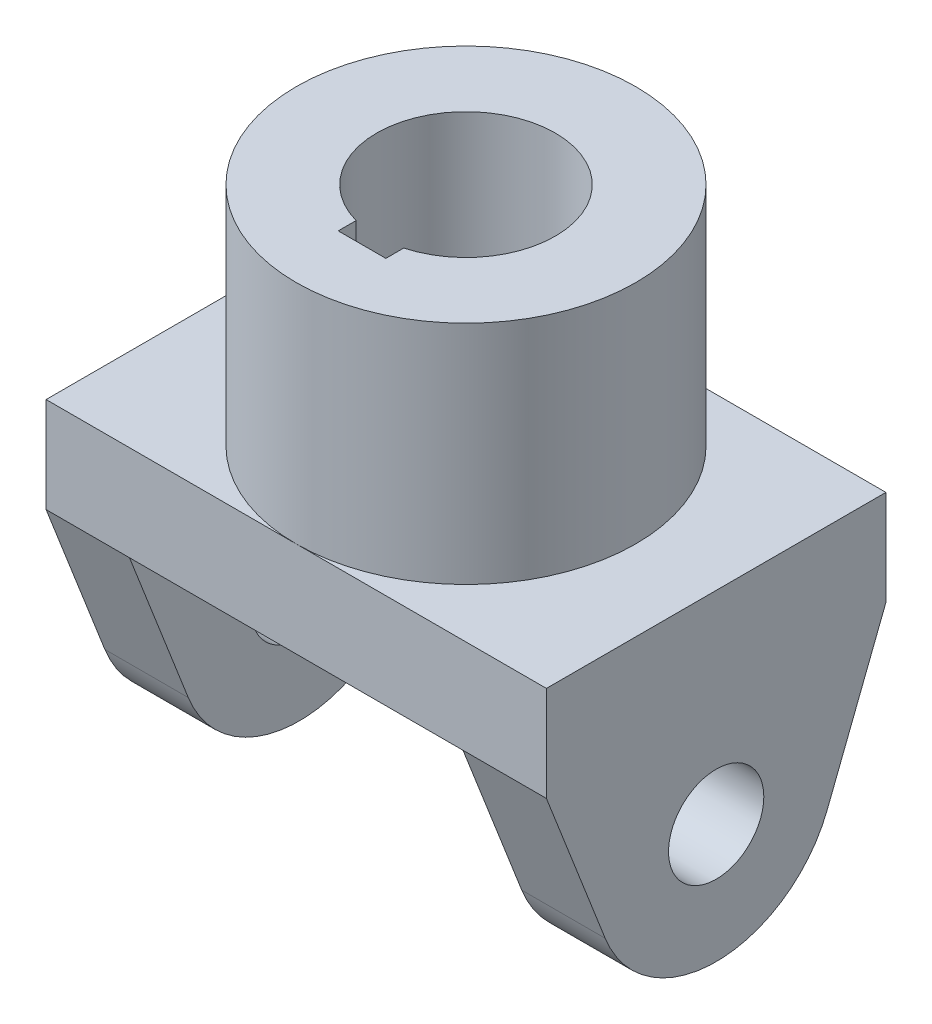
ISO-10303-21;
HEADER;
FILE_DESCRIPTION(('STEP AP214'),'2;1');
FILE_NAME('part.step','',(''),(''),'','','');
FILE_SCHEMA(('AUTOMOTIVE_DESIGN { 1 0 10303 214 1 1 1 1 }'));
ENDSEC;
DATA;
#1=APPLICATION_CONTEXT('core data for automotive mechanical design processes');
#2=APPLICATION_PROTOCOL_DEFINITION('international standard','automotive_design',2000,#1);
#3=PRODUCT_CONTEXT('',#1,'mechanical');
#4=PRODUCT('Part','Part','',(#3));
#5=PRODUCT_RELATED_PRODUCT_CATEGORY('part','',(#4));
#6=PRODUCT_DEFINITION_FORMATION('','',#4);
#7=PRODUCT_DEFINITION_CONTEXT('part definition',#1,'design');
#8=PRODUCT_DEFINITION('design','',#6,#7);
#9=PRODUCT_DEFINITION_SHAPE('','',#8);
#10=(LENGTH_UNIT() NAMED_UNIT(*) SI_UNIT(.MILLI.,.METRE.));
#11=(NAMED_UNIT(*) PLANE_ANGLE_UNIT() SI_UNIT($,.RADIAN.));
#12=(NAMED_UNIT(*) SI_UNIT($,.STERADIAN.) SOLID_ANGLE_UNIT());
#13=UNCERTAINTY_MEASURE_WITH_UNIT(LENGTH_MEASURE(1.E-05),#10,'distance_accuracy_value','');
#14=(GEOMETRIC_REPRESENTATION_CONTEXT(3) GLOBAL_UNCERTAINTY_ASSIGNED_CONTEXT((#13)) GLOBAL_UNIT_ASSIGNED_CONTEXT((#10,
#11,#12)) REPRESENTATION_CONTEXT('',''));
#15=CARTESIAN_POINT('',(0.,0.,0.));
#16=DIRECTION('',(0.,0.,1.));
#17=DIRECTION('',(1.,0.,0.));
#18=AXIS2_PLACEMENT_3D('',#15,#16,#17);
#19=CARTESIAN_POINT('',(0.,-16.,0.));
#20=DIRECTION('',(0.,-1.,0.));
#21=DIRECTION('',(0.,0.,-1.));
#22=AXIS2_PLACEMENT_3D('',#19,#20,#21);
#23=PLANE('',#22);
#24=CARTESIAN_POINT('',(0.,-16.,0.));
#25=DIRECTION('',(0.,-1.,0.));
#26=DIRECTION('',(0.,0.,-1.));
#27=AXIS2_PLACEMENT_3D('',#24,#25,#26);
#28=CIRCLE('',#27,15.);
#29=CARTESIAN_POINT('',(0.,-16.,-15.));
#30=VERTEX_POINT('',#29);
#31=EDGE_CURVE('E37',#30,#30,#28,.T.);
#32=ORIENTED_EDGE('',*,*,#31,.F.);
#33=EDGE_LOOP('',(#32));
#34=FACE_BOUND('',#33,.T.);
#35=DIRECTION('',(-1.,0.,0.));
#36=VECTOR('',#35,1.);
#37=CARTESIAN_POINT('',(-42.,-16.,28.5));
#38=LINE('',#37,#36);
#39=CARTESIAN_POINT('',(28.,-16.,28.5));
#40=VERTEX_POINT('',#39);
#41=CARTESIAN_POINT('',(-28.,-16.,28.5));
#42=VERTEX_POINT('',#41);
#43=EDGE_CURVE('E242',#40,#42,#38,.T.);
#44=ORIENTED_EDGE('',*,*,#43,.T.);
#45=DIRECTION('',(0.,0.,1.));
#46=VECTOR('',#45,1.);
#47=CARTESIAN_POINT('',(-28.,-16.,-28.5));
#48=LINE('',#47,#46);
#49=CARTESIAN_POINT('',(-28.,-16.,-28.5));
#50=VERTEX_POINT('',#49);
#51=EDGE_CURVE('E184',#50,#42,#48,.T.);
#52=ORIENTED_EDGE('',*,*,#51,.F.);
#53=DIRECTION('',(1.,0.,0.));
#54=VECTOR('',#53,1.);
#55=CARTESIAN_POINT('',(-42.,-16.,-28.5));
#56=LINE('',#55,#54);
#57=CARTESIAN_POINT('',(28.,-16.,-28.5));
#58=VERTEX_POINT('',#57);
#59=EDGE_CURVE('E241',#50,#58,#56,.T.);
#60=ORIENTED_EDGE('',*,*,#59,.T.);
#61=DIRECTION('',(0.,0.,1.));
#62=VECTOR('',#61,1.);
#63=CARTESIAN_POINT('',(28.,-16.,-28.5));
#64=LINE('',#63,#62);
#65=EDGE_CURVE('E214',#58,#40,#64,.T.);
#66=ORIENTED_EDGE('',*,*,#65,.T.);
#67=EDGE_LOOP('',(#44,#52,#60,#66));
#68=FACE_BOUND('',#67,.T.);
#69=ADVANCED_FACE('F33',(#34,#68),#23,.T.);
#70=CARTESIAN_POINT('',(0.,38.,0.));
#71=DIRECTION('',(0.,1.,0.));
#72=DIRECTION('',(0.,0.,1.));
#73=AXIS2_PLACEMENT_3D('',#70,#71,#72);
#74=PLANE('',#73);
#75=DIRECTION('',(0.,0.,1.));
#76=VECTOR('',#75,1.);
#77=CARTESIAN_POINT('',(-4.00000000000001,38.,14.456832294801));
#78=LINE('',#77,#76);
#79=CARTESIAN_POINT('',(-4.00000000000001,38.,14.456832294801));
#80=VERTEX_POINT('',#79);
#81=CARTESIAN_POINT('',(-4.00000000000001,38.,17.456832294801));
#82=VERTEX_POINT('',#81);
#83=EDGE_CURVE('E552',#80,#82,#78,.T.);
#84=ORIENTED_EDGE('',*,*,#83,.F.);
#85=CARTESIAN_POINT('',(0.,38.,0.));
#86=DIRECTION('',(0.,1.,0.));
#87=DIRECTION('',(0.,0.,1.));
#88=AXIS2_PLACEMENT_3D('',#85,#86,#87);
#89=CIRCLE('',#88,15.);
#90=CARTESIAN_POINT('',(3.99999999999999,38.,14.456832294801));
#91=VERTEX_POINT('',#90);
#92=EDGE_CURVE('E269',#91,#80,#89,.T.);
#93=ORIENTED_EDGE('',*,*,#92,.F.);
#94=DIRECTION('',(0.,0.,-1.));
#95=VECTOR('',#94,1.);
#96=CARTESIAN_POINT('',(3.99999999999999,38.,17.456832294801));
#97=LINE('',#96,#95);
#98=CARTESIAN_POINT('',(3.99999999999999,38.,17.456832294801));
#99=VERTEX_POINT('',#98);
#100=EDGE_CURVE('E168',#99,#91,#97,.T.);
#101=ORIENTED_EDGE('',*,*,#100,.F.);
#102=DIRECTION('',(1.,0.,0.));
#103=VECTOR('',#102,1.);
#104=CARTESIAN_POINT('',(-4.00000000000001,38.,17.456832294801));
#105=LINE('',#104,#103);
#106=EDGE_CURVE('E555',#82,#99,#105,.T.);
#107=ORIENTED_EDGE('',*,*,#106,.F.);
#108=EDGE_LOOP('',(#84,#93,#101,#107));
#109=FACE_BOUND('',#108,.T.);
#110=CARTESIAN_POINT('',(0.,38.,0.));
#111=DIRECTION('',(0.,1.,0.));
#112=DIRECTION('',(0.,0.,1.));
#113=AXIS2_PLACEMENT_3D('',#110,#111,#112);
#114=CIRCLE('',#113,28.5);
#115=CARTESIAN_POINT('',(0.,38.,28.5));
#116=VERTEX_POINT('',#115);
#117=EDGE_CURVE('E11',#116,#116,#114,.T.);
#118=ORIENTED_EDGE('',*,*,#117,.T.);
#119=EDGE_LOOP('',(#118));
#120=FACE_BOUND('',#119,.T.);
#121=ADVANCED_FACE('F332',(#109,#120),#74,.T.);
#122=CARTESIAN_POINT('',(0.,38.,0.));
#123=DIRECTION('',(0.,-1.,0.));
#124=DIRECTION('',(0.,0.,-1.));
#125=AXIS2_PLACEMENT_3D('',#122,#123,#124);
#126=CYLINDRICAL_SURFACE('',#125,28.5);
#127=ORIENTED_EDGE('',*,*,#117,.F.);
#128=EDGE_LOOP('',(#127));
#129=FACE_BOUND('',#128,.T.);
#130=CARTESIAN_POINT('',(0.,0.,0.));
#131=DIRECTION('',(0.,1.,0.));
#132=DIRECTION('',(0.,0.,1.));
#133=AXIS2_PLACEMENT_3D('',#130,#131,#132);
#134=CIRCLE('',#133,28.5);
#135=CARTESIAN_POINT('',(0.,0.,28.5));
#136=VERTEX_POINT('',#135);
#137=CARTESIAN_POINT('',(0.,0.,-28.5));
#138=VERTEX_POINT('',#137);
#139=EDGE_CURVE('E42',#136,#138,#134,.T.);
#140=ORIENTED_EDGE('',*,*,#139,.T.);
#141=EDGE_CURVE('E270',#138,#136,#134,.T.);
#142=ORIENTED_EDGE('',*,*,#141,.T.);
#143=EDGE_LOOP('',(#140,#142));
#144=FACE_BOUND('',#143,.T.);
#145=ADVANCED_FACE('F35',(#129,#144),#126,.T.);
#146=CARTESIAN_POINT('',(0.,38.,0.));
#147=DIRECTION('',(0.,-1.,0.));
#148=DIRECTION('',(0.,0.,-1.));
#149=AXIS2_PLACEMENT_3D('',#146,#147,#148);
#150=CYLINDRICAL_SURFACE('',#149,15.);
#151=DIRECTION('',(0.,1.,0.));
#152=VECTOR('',#151,1.);
#153=CARTESIAN_POINT('',(-4.00000000000001,-8.54400374531754,14.456832294801));
#154=LINE('',#153,#152);
#155=CARTESIAN_POINT('',(-4.00000000000001,0.,14.456832294801));
#156=VERTEX_POINT('',#155);
#157=EDGE_CURVE('E153',#156,#80,#154,.T.);
#158=ORIENTED_EDGE('',*,*,#157,.F.);
#159=CARTESIAN_POINT('',(0.,0.,0.));
#160=DIRECTION('',(0.,1.,0.));
#161=DIRECTION('',(0.,0.,1.));
#162=AXIS2_PLACEMENT_3D('',#159,#160,#161);
#163=CIRCLE('',#162,15.);
#164=CARTESIAN_POINT('',(3.99999999999999,0.,14.456832294801));
#165=VERTEX_POINT('',#164);
#166=EDGE_CURVE('E145',#156,#165,#163,.T.);
#167=ORIENTED_EDGE('',*,*,#166,.T.);
#168=DIRECTION('',(0.,1.,0.));
#169=VECTOR('',#168,1.);
#170=CARTESIAN_POINT('',(3.99999999999999,-8.54400374531754,14.456832294801));
#171=LINE('',#170,#169);
#172=EDGE_CURVE('E151',#165,#91,#171,.T.);
#173=ORIENTED_EDGE('',*,*,#172,.T.);
#174=ORIENTED_EDGE('',*,*,#92,.T.);
#175=EDGE_LOOP('',(#158,#167,#173,#174));
#176=FACE_BOUND('',#175,.T.);
#177=ORIENTED_EDGE('',*,*,#31,.T.);
#178=EDGE_LOOP('',(#177));
#179=FACE_BOUND('',#178,.T.);
#180=ADVANCED_FACE('F147',(#176,#179),#150,.F.);
#181=CARTESIAN_POINT('',(0.,0.,0.));
#182=DIRECTION('',(0.,-1.,0.));
#183=DIRECTION('',(0.,0.,-1.));
#184=AXIS2_PLACEMENT_3D('',#181,#182,#183);
#185=PLANE('',#184);
#186=ORIENTED_EDGE('',*,*,#166,.F.);
#187=DIRECTION('',(0.,0.,1.));
#188=VECTOR('',#187,1.);
#189=CARTESIAN_POINT('',(-4.00000000000001,0.,14.456832294801));
#190=LINE('',#189,#188);
#191=CARTESIAN_POINT('',(-4.00000000000001,0.,17.456832294801));
#192=VERTEX_POINT('',#191);
#193=EDGE_CURVE('E176',#156,#192,#190,.T.);
#194=ORIENTED_EDGE('',*,*,#193,.T.);
#195=DIRECTION('',(1.,0.,0.));
#196=VECTOR('',#195,1.);
#197=CARTESIAN_POINT('',(-4.00000000000001,0.,17.456832294801));
#198=LINE('',#197,#196);
#199=CARTESIAN_POINT('',(3.99999999999999,0.,17.456832294801));
#200=VERTEX_POINT('',#199);
#201=EDGE_CURVE('E161',#192,#200,#198,.T.);
#202=ORIENTED_EDGE('',*,*,#201,.T.);
#203=DIRECTION('',(0.,0.,-1.));
#204=VECTOR('',#203,1.);
#205=CARTESIAN_POINT('',(3.99999999999999,0.,17.456832294801));
#206=LINE('',#205,#204);
#207=EDGE_CURVE('E159',#200,#165,#206,.T.);
#208=ORIENTED_EDGE('',*,*,#207,.T.);
#209=EDGE_LOOP('',(#186,#194,#202,#208));
#210=FACE_BOUND('',#209,.T.);
#211=ADVANCED_FACE('F160',(#210),#185,.F.);
#212=ORIENTED_EDGE('',*,*,#139,.F.);
#213=DIRECTION('',(-1.,0.,0.));
#214=VECTOR('',#213,1.);
#215=CARTESIAN_POINT('',(-42.,0.,28.5));
#216=LINE('',#215,#214);
#217=CARTESIAN_POINT('',(42.,0.,28.5));
#218=VERTEX_POINT('',#217);
#219=EDGE_CURVE('E250',#218,#136,#216,.T.);
#220=ORIENTED_EDGE('',*,*,#219,.F.);
#221=DIRECTION('',(0.,0.,1.));
#222=VECTOR('',#221,1.);
#223=CARTESIAN_POINT('',(42.,0.,28.5));
#224=LINE('',#223,#222);
#225=CARTESIAN_POINT('',(42.,0.,-28.5));
#226=VERTEX_POINT('',#225);
#227=EDGE_CURVE('E235',#226,#218,#224,.T.);
#228=ORIENTED_EDGE('',*,*,#227,.F.);
#229=DIRECTION('',(1.,0.,0.));
#230=VECTOR('',#229,1.);
#231=CARTESIAN_POINT('',(-42.,0.,-28.5));
#232=LINE('',#231,#230);
#233=EDGE_CURVE('E254',#138,#226,#232,.T.);
#234=ORIENTED_EDGE('',*,*,#233,.F.);
#235=EDGE_LOOP('',(#212,#220,#228,#234));
#236=FACE_BOUND('',#235,.T.);
#237=ADVANCED_FACE('F283',(#236),#185,.F.);
#238=CARTESIAN_POINT('',(42.,-16.,28.5));
#239=DIRECTION('',(-1.,0.,0.));
#240=DIRECTION('',(0.,0.,1.));
#241=AXIS2_PLACEMENT_3D('',#238,#239,#240);
#242=PLANE('',#241);
#243=ORIENTED_EDGE('',*,*,#227,.T.);
#244=DIRECTION('',(0.,1.,0.));
#245=VECTOR('',#244,1.);
#246=CARTESIAN_POINT('',(42.,-16.,28.5));
#247=LINE('',#246,#245);
#248=CARTESIAN_POINT('',(42.,-16.,28.5));
#249=VERTEX_POINT('',#248);
#250=EDGE_CURVE('E266',#249,#218,#247,.T.);
#251=ORIENTED_EDGE('',*,*,#250,.F.);
#252=DIRECTION('',(0.,-0.931494554757971,-0.363755267255676));
#253=VECTOR('',#252,1.);
#254=CARTESIAN_POINT('',(42.,-16.,28.5));
#255=LINE('',#254,#253);
#256=CARTESIAN_POINT('',(42.,-41.2751053451135,18.6298910951594));
#257=VERTEX_POINT('',#256);
#258=EDGE_CURVE('E211',#249,#257,#255,.T.);
#259=ORIENTED_EDGE('',*,*,#258,.T.);
#260=CARTESIAN_POINT('',(42.,-34.,0.));
#261=DIRECTION('',(1.,0.,0.));
#262=DIRECTION('',(0.,0.,-1.));
#263=AXIS2_PLACEMENT_3D('',#260,#261,#262);
#264=CIRCLE('',#263,20.);
#265=CARTESIAN_POINT('',(42.,-41.2751053451135,-18.6298910951594));
#266=VERTEX_POINT('',#265);
#267=EDGE_CURVE('E228',#257,#266,#264,.T.);
#268=ORIENTED_EDGE('',*,*,#267,.T.);
#269=DIRECTION('',(0.,0.931494554757971,-0.363755267255677));
#270=VECTOR('',#269,1.);
#271=CARTESIAN_POINT('',(42.,-16.,-28.5));
#272=LINE('',#271,#270);
#273=CARTESIAN_POINT('',(42.,-16.,-28.5));
#274=VERTEX_POINT('',#273);
#275=EDGE_CURVE('E217',#266,#274,#272,.T.);
#276=ORIENTED_EDGE('',*,*,#275,.T.);
#277=DIRECTION('',(0.,1.,0.));
#278=VECTOR('',#277,1.);
#279=CARTESIAN_POINT('',(42.,-16.,-28.5));
#280=LINE('',#279,#278);
#281=EDGE_CURVE('E246',#274,#226,#280,.T.);
#282=ORIENTED_EDGE('',*,*,#281,.T.);
#283=EDGE_LOOP('',(#243,#251,#259,#268,#276,#282));
#284=FACE_BOUND('',#283,.T.);
#285=CARTESIAN_POINT('',(42.,-34.,0.));
#286=DIRECTION('',(1.,0.,0.));
#287=DIRECTION('',(0.,0.,-1.));
#288=AXIS2_PLACEMENT_3D('',#285,#286,#287);
#289=CIRCLE('',#288,8.);
#290=CARTESIAN_POINT('',(42.,-34.,-7.99999999999999));
#291=VERTEX_POINT('',#290);
#292=EDGE_CURVE('E202',#291,#291,#289,.T.);
#293=ORIENTED_EDGE('',*,*,#292,.F.);
#294=EDGE_LOOP('',(#293));
#295=FACE_BOUND('',#294,.T.);
#296=ADVANCED_FACE('F298',(#284,#295),#242,.F.);
#297=CARTESIAN_POINT('',(-42.,-16.,28.5));
#298=DIRECTION('',(0.,0.,-1.));
#299=DIRECTION('',(-1.,0.,0.));
#300=AXIS2_PLACEMENT_3D('',#297,#298,#299);
#301=PLANE('',#300);
#302=ORIENTED_EDGE('',*,*,#219,.T.);
#303=CARTESIAN_POINT('',(-42.,0.,28.5));
#304=VERTEX_POINT('',#303);
#305=EDGE_CURVE('E249',#136,#304,#216,.T.);
#306=ORIENTED_EDGE('',*,*,#305,.T.);
#307=DIRECTION('',(0.,1.,0.));
#308=VECTOR('',#307,1.);
#309=CARTESIAN_POINT('',(-42.,-16.,28.5));
#310=LINE('',#309,#308);
#311=CARTESIAN_POINT('',(-42.,-16.,28.5));
#312=VERTEX_POINT('',#311);
#313=EDGE_CURVE('E263',#312,#304,#310,.T.);
#314=ORIENTED_EDGE('',*,*,#313,.F.);
#315=DIRECTION('',(-1.,0.,0.));
#316=VECTOR('',#315,1.);
#317=CARTESIAN_POINT('',(-28.,-16.,28.5));
#318=LINE('',#317,#316);
#319=EDGE_CURVE('E50',#42,#312,#318,.T.);
#320=ORIENTED_EDGE('',*,*,#319,.F.);
#321=ORIENTED_EDGE('',*,*,#43,.F.);
#322=EDGE_CURVE('E239',#249,#40,#38,.T.);
#323=ORIENTED_EDGE('',*,*,#322,.F.);
#324=ORIENTED_EDGE('',*,*,#250,.T.);
#325=EDGE_LOOP('',(#302,#306,#314,#320,#321,#323,#324));
#326=FACE_BOUND('',#325,.T.);
#327=ADVANCED_FACE('F294',(#326),#301,.F.);
#328=CARTESIAN_POINT('',(-42.,-16.,28.5));
#329=DIRECTION('',(1.,0.,0.));
#330=DIRECTION('',(0.,0.,-1.));
#331=AXIS2_PLACEMENT_3D('',#328,#329,#330);
#332=PLANE('',#331);
#333=DIRECTION('',(0.,0.,-1.));
#334=VECTOR('',#333,1.);
#335=CARTESIAN_POINT('',(-42.,0.,28.5));
#336=LINE('',#335,#334);
#337=CARTESIAN_POINT('',(-42.,0.,-28.5));
#338=VERTEX_POINT('',#337);
#339=EDGE_CURVE('E252',#304,#338,#336,.T.);
#340=ORIENTED_EDGE('',*,*,#339,.T.);
#341=DIRECTION('',(0.,1.,0.));
#342=VECTOR('',#341,1.);
#343=CARTESIAN_POINT('',(-42.,-16.,-28.5));
#344=LINE('',#343,#342);
#345=CARTESIAN_POINT('',(-42.,-16.,-28.5));
#346=VERTEX_POINT('',#345);
#347=EDGE_CURVE('E260',#346,#338,#344,.T.);
#348=ORIENTED_EDGE('',*,*,#347,.F.);
#349=DIRECTION('',(0.,0.931494554757971,-0.363755267255677));
#350=VECTOR('',#349,1.);
#351=CARTESIAN_POINT('',(-42.,-16.,-28.5));
#352=LINE('',#351,#350);
#353=CARTESIAN_POINT('',(-42.,-41.2751053451135,-18.6298910951594));
#354=VERTEX_POINT('',#353);
#355=EDGE_CURVE('E181',#354,#346,#352,.T.);
#356=ORIENTED_EDGE('',*,*,#355,.F.);
#357=CARTESIAN_POINT('',(-42.,-34.,0.));
#358=DIRECTION('',(1.,0.,0.));
#359=DIRECTION('',(0.,0.,-1.));
#360=AXIS2_PLACEMENT_3D('',#357,#358,#359);
#361=CIRCLE('',#360,20.);
#362=CARTESIAN_POINT('',(-42.,-41.2751053451135,18.6298910951594));
#363=VERTEX_POINT('',#362);
#364=EDGE_CURVE('E198',#363,#354,#361,.T.);
#365=ORIENTED_EDGE('',*,*,#364,.F.);
#366=DIRECTION('',(0.,-0.931494554757971,-0.363755267255676));
#367=VECTOR('',#366,1.);
#368=CARTESIAN_POINT('',(-42.,-16.,28.5));
#369=LINE('',#368,#367);
#370=EDGE_CURVE('E188',#312,#363,#369,.T.);
#371=ORIENTED_EDGE('',*,*,#370,.F.);
#372=ORIENTED_EDGE('',*,*,#313,.T.);
#373=EDGE_LOOP('',(#340,#348,#356,#365,#371,#372));
#374=FACE_BOUND('',#373,.T.);
#375=CARTESIAN_POINT('',(-42.,-34.,0.));
#376=DIRECTION('',(1.,0.,0.));
#377=DIRECTION('',(0.,0.,-1.));
#378=AXIS2_PLACEMENT_3D('',#375,#376,#377);
#379=CIRCLE('',#378,8.);
#380=CARTESIAN_POINT('',(-42.,-34.,-7.99999999999999));
#381=VERTEX_POINT('',#380);
#382=EDGE_CURVE('E170',#381,#381,#379,.T.);
#383=ORIENTED_EDGE('',*,*,#382,.T.);
#384=EDGE_LOOP('',(#383));
#385=FACE_BOUND('',#384,.T.);
#386=ADVANCED_FACE('F290',(#374,#385),#332,.F.);
#387=CARTESIAN_POINT('',(-42.,-16.,-28.5));
#388=DIRECTION('',(0.,0.,1.));
#389=DIRECTION('',(1.,0.,0.));
#390=AXIS2_PLACEMENT_3D('',#387,#388,#389);
#391=PLANE('',#390);
#392=EDGE_CURVE('E255',#338,#138,#232,.T.);
#393=ORIENTED_EDGE('',*,*,#392,.T.);
#394=ORIENTED_EDGE('',*,*,#233,.T.);
#395=ORIENTED_EDGE('',*,*,#281,.F.);
#396=DIRECTION('',(1.,0.,0.));
#397=VECTOR('',#396,1.);
#398=CARTESIAN_POINT('',(28.,-16.,-28.5));
#399=LINE('',#398,#397);
#400=EDGE_CURVE('E233',#58,#274,#399,.T.);
#401=ORIENTED_EDGE('',*,*,#400,.F.);
#402=ORIENTED_EDGE('',*,*,#59,.F.);
#403=EDGE_CURVE('E243',#346,#50,#56,.T.);
#404=ORIENTED_EDGE('',*,*,#403,.F.);
#405=ORIENTED_EDGE('',*,*,#347,.T.);
#406=EDGE_LOOP('',(#393,#394,#395,#401,#402,#404,#405));
#407=FACE_BOUND('',#406,.T.);
#408=ADVANCED_FACE('F286',(#407),#391,.F.);
#409=ORIENTED_EDGE('',*,*,#141,.F.);
#410=ORIENTED_EDGE('',*,*,#392,.F.);
#411=ORIENTED_EDGE('',*,*,#339,.F.);
#412=ORIENTED_EDGE('',*,*,#305,.F.);
#413=EDGE_LOOP('',(#409,#410,#411,#412));
#414=FACE_BOUND('',#413,.T.);
#415=ADVANCED_FACE('F279',(#414),#185,.F.);
#416=CARTESIAN_POINT('',(28.,-16.,-28.5));
#417=DIRECTION('',(0.,-0.363755267255677,-0.931494554757971));
#418=DIRECTION('',(0.,0.931494554757971,-0.363755267255677));
#419=AXIS2_PLACEMENT_3D('',#416,#417,#418);
#420=PLANE('',#419);
#421=ORIENTED_EDGE('',*,*,#275,.F.);
#422=DIRECTION('',(1.,0.,0.));
#423=VECTOR('',#422,1.);
#424=CARTESIAN_POINT('',(28.,-41.2751053451135,-18.6298910951594));
#425=LINE('',#424,#423);
#426=CARTESIAN_POINT('',(28.,-41.2751053451135,-18.6298910951594));
#427=VERTEX_POINT('',#426);
#428=EDGE_CURVE('E236',#427,#266,#425,.T.);
#429=ORIENTED_EDGE('',*,*,#428,.F.);
#430=DIRECTION('',(0.,0.931494554757971,-0.363755267255677));
#431=VECTOR('',#430,1.);
#432=CARTESIAN_POINT('',(28.,-16.,-28.5));
#433=LINE('',#432,#431);
#434=EDGE_CURVE('E222',#427,#58,#433,.T.);
#435=ORIENTED_EDGE('',*,*,#434,.T.);
#436=ORIENTED_EDGE('',*,*,#400,.T.);
#437=EDGE_LOOP('',(#421,#429,#435,#436));
#438=FACE_BOUND('',#437,.T.);
#439=ADVANCED_FACE('F304',(#438),#420,.T.);
#440=CARTESIAN_POINT('',(28.,-34.,0.));
#441=DIRECTION('',(1.,0.,0.));
#442=DIRECTION('',(0.,0.,-1.));
#443=AXIS2_PLACEMENT_3D('',#440,#441,#442);
#444=CYLINDRICAL_SURFACE('',#443,20.);
#445=ORIENTED_EDGE('',*,*,#267,.F.);
#446=DIRECTION('',(1.,0.,0.));
#447=VECTOR('',#446,1.);
#448=CARTESIAN_POINT('',(28.,-41.2751053451135,18.6298910951594));
#449=LINE('',#448,#447);
#450=CARTESIAN_POINT('',(28.,-41.2751053451135,18.6298910951594));
#451=VERTEX_POINT('',#450);
#452=EDGE_CURVE('E225',#451,#257,#449,.T.);
#453=ORIENTED_EDGE('',*,*,#452,.F.);
#454=CARTESIAN_POINT('',(28.,-34.,0.));
#455=DIRECTION('',(1.,0.,0.));
#456=DIRECTION('',(0.,0.,-1.));
#457=AXIS2_PLACEMENT_3D('',#454,#455,#456);
#458=CIRCLE('',#457,20.);
#459=EDGE_CURVE('E219',#451,#427,#458,.T.);
#460=ORIENTED_EDGE('',*,*,#459,.T.);
#461=ORIENTED_EDGE('',*,*,#428,.T.);
#462=EDGE_LOOP('',(#445,#453,#460,#461));
#463=FACE_BOUND('',#462,.T.);
#464=ADVANCED_FACE('F443',(#463),#444,.T.);
#465=CARTESIAN_POINT('',(28.,-16.,28.5));
#466=DIRECTION('',(0.,-0.363755267255676,0.931494554757971));
#467=DIRECTION('',(0.,-0.931494554757971,-0.363755267255676));
#468=AXIS2_PLACEMENT_3D('',#465,#466,#467);
#469=PLANE('',#468);
#470=ORIENTED_EDGE('',*,*,#258,.F.);
#471=ORIENTED_EDGE('',*,*,#322,.T.);
#472=DIRECTION('',(0.,-0.931494554757971,-0.363755267255676));
#473=VECTOR('',#472,1.);
#474=CARTESIAN_POINT('',(28.,-16.,28.5));
#475=LINE('',#474,#473);
#476=EDGE_CURVE('E58',#40,#451,#475,.T.);
#477=ORIENTED_EDGE('',*,*,#476,.T.);
#478=ORIENTED_EDGE('',*,*,#452,.T.);
#479=EDGE_LOOP('',(#470,#471,#477,#478));
#480=FACE_BOUND('',#479,.T.);
#481=ADVANCED_FACE('F342',(#480),#469,.T.);
#482=CARTESIAN_POINT('',(28.,-34.,0.));
#483=DIRECTION('',(1.,0.,0.));
#484=DIRECTION('',(0.,0.,-1.));
#485=AXIS2_PLACEMENT_3D('',#482,#483,#484);
#486=PLANE('',#485);
#487=CARTESIAN_POINT('',(28.,-34.,0.));
#488=DIRECTION('',(1.,0.,0.));
#489=DIRECTION('',(0.,0.,-1.));
#490=AXIS2_PLACEMENT_3D('',#487,#488,#489);
#491=CIRCLE('',#490,8.);
#492=CARTESIAN_POINT('',(28.,-34.,-8.));
#493=VERTEX_POINT('',#492);
#494=EDGE_CURVE('E208',#493,#493,#491,.T.);
#495=ORIENTED_EDGE('',*,*,#494,.T.);
#496=EDGE_LOOP('',(#495));
#497=FACE_BOUND('',#496,.T.);
#498=ORIENTED_EDGE('',*,*,#65,.F.);
#499=ORIENTED_EDGE('',*,*,#434,.F.);
#500=ORIENTED_EDGE('',*,*,#459,.F.);
#501=ORIENTED_EDGE('',*,*,#476,.F.);
#502=EDGE_LOOP('',(#498,#499,#500,#501));
#503=FACE_BOUND('',#502,.T.);
#504=ADVANCED_FACE('F306',(#497,#503),#486,.F.);
#505=CARTESIAN_POINT('',(28.,-34.,0.));
#506=DIRECTION('',(1.,0.,0.));
#507=DIRECTION('',(0.,0.,-1.));
#508=AXIS2_PLACEMENT_3D('',#505,#506,#507);
#509=CYLINDRICAL_SURFACE('',#508,8.);
#510=ORIENTED_EDGE('',*,*,#494,.F.);
#511=EDGE_LOOP('',(#510));
#512=FACE_BOUND('',#511,.T.);
#513=ORIENTED_EDGE('',*,*,#292,.T.);
#514=EDGE_LOOP('',(#513));
#515=FACE_BOUND('',#514,.T.);
#516=ADVANCED_FACE('F329',(#512,#515),#509,.F.);
#517=CARTESIAN_POINT('',(-28.,-34.,0.));
#518=DIRECTION('',(-1.,0.,0.));
#519=DIRECTION('',(0.,0.,-1.));
#520=AXIS2_PLACEMENT_3D('',#517,#518,#519);
#521=PLANE('',#520);
#522=ORIENTED_EDGE('',*,*,#51,.T.);
#523=DIRECTION('',(0.,-0.931494554757971,-0.363755267255676));
#524=VECTOR('',#523,1.);
#525=CARTESIAN_POINT('',(-28.,-16.,28.5));
#526=LINE('',#525,#524);
#527=CARTESIAN_POINT('',(-28.,-41.2751053451135,18.6298910951594));
#528=VERTEX_POINT('',#527);
#529=EDGE_CURVE('E193',#42,#528,#526,.T.);
#530=ORIENTED_EDGE('',*,*,#529,.T.);
#531=CARTESIAN_POINT('',(-28.,-34.,0.));
#532=DIRECTION('',(1.,0.,0.));
#533=DIRECTION('',(0.,0.,-1.));
#534=AXIS2_PLACEMENT_3D('',#531,#532,#533);
#535=CIRCLE('',#534,20.);
#536=CARTESIAN_POINT('',(-28.,-41.2751053451135,-18.6298910951594));
#537=VERTEX_POINT('',#536);
#538=EDGE_CURVE('E191',#528,#537,#535,.T.);
#539=ORIENTED_EDGE('',*,*,#538,.T.);
#540=DIRECTION('',(0.,0.931494554757971,-0.363755267255677));
#541=VECTOR('',#540,1.);
#542=CARTESIAN_POINT('',(-28.,-16.,-28.5));
#543=LINE('',#542,#541);
#544=EDGE_CURVE('E187',#537,#50,#543,.T.);
#545=ORIENTED_EDGE('',*,*,#544,.T.);
#546=EDGE_LOOP('',(#522,#530,#539,#545));
#547=FACE_BOUND('',#546,.T.);
#548=CARTESIAN_POINT('',(-28.,-34.,0.));
#549=DIRECTION('',(1.,0.,0.));
#550=DIRECTION('',(0.,0.,-1.));
#551=AXIS2_PLACEMENT_3D('',#548,#549,#550);
#552=CIRCLE('',#551,8.);
#553=CARTESIAN_POINT('',(-28.,-34.,-8.));
#554=VERTEX_POINT('',#553);
#555=EDGE_CURVE('E178',#554,#554,#552,.T.);
#556=ORIENTED_EDGE('',*,*,#555,.F.);
#557=EDGE_LOOP('',(#556));
#558=FACE_BOUND('',#557,.T.);
#559=ADVANCED_FACE('F311',(#547,#558),#521,.F.);
#560=CARTESIAN_POINT('',(-28.,-16.,28.5));
#561=DIRECTION('',(0.,0.363755267255676,-0.931494554757971));
#562=DIRECTION('',(0.,0.931494554757971,0.363755267255676));
#563=AXIS2_PLACEMENT_3D('',#560,#561,#562);
#564=PLANE('',#563);
#565=ORIENTED_EDGE('',*,*,#370,.T.);
#566=DIRECTION('',(-1.,0.,0.));
#567=VECTOR('',#566,1.);
#568=CARTESIAN_POINT('',(-28.,-41.2751053451135,18.6298910951594));
#569=LINE('',#568,#567);
#570=EDGE_CURVE('E203',#528,#363,#569,.T.);
#571=ORIENTED_EDGE('',*,*,#570,.F.);
#572=ORIENTED_EDGE('',*,*,#529,.F.);
#573=ORIENTED_EDGE('',*,*,#319,.T.);
#574=EDGE_LOOP('',(#565,#571,#572,#573));
#575=FACE_BOUND('',#574,.T.);
#576=ADVANCED_FACE('F321',(#575),#564,.F.);
#577=CARTESIAN_POINT('',(-28.,-34.,0.));
#578=DIRECTION('',(-1.,0.,0.));
#579=DIRECTION('',(0.,0.,1.));
#580=AXIS2_PLACEMENT_3D('',#577,#578,#579);
#581=CYLINDRICAL_SURFACE('',#580,20.);
#582=ORIENTED_EDGE('',*,*,#364,.T.);
#583=DIRECTION('',(-1.,0.,0.));
#584=VECTOR('',#583,1.);
#585=CARTESIAN_POINT('',(-28.,-41.2751053451135,-18.6298910951594));
#586=LINE('',#585,#584);
#587=EDGE_CURVE('E195',#537,#354,#586,.T.);
#588=ORIENTED_EDGE('',*,*,#587,.F.);
#589=ORIENTED_EDGE('',*,*,#538,.F.);
#590=ORIENTED_EDGE('',*,*,#570,.T.);
#591=EDGE_LOOP('',(#582,#588,#589,#590));
#592=FACE_BOUND('',#591,.T.);
#593=ADVANCED_FACE('F318',(#592),#581,.T.);
#594=CARTESIAN_POINT('',(-28.,-16.,-28.5));
#595=DIRECTION('',(0.,0.363755267255677,0.931494554757971));
#596=DIRECTION('',(0.,-0.931494554757971,0.363755267255677));
#597=AXIS2_PLACEMENT_3D('',#594,#595,#596);
#598=PLANE('',#597);
#599=ORIENTED_EDGE('',*,*,#355,.T.);
#600=ORIENTED_EDGE('',*,*,#403,.T.);
#601=ORIENTED_EDGE('',*,*,#544,.F.);
#602=ORIENTED_EDGE('',*,*,#587,.T.);
#603=EDGE_LOOP('',(#599,#600,#601,#602));
#604=FACE_BOUND('',#603,.T.);
#605=ADVANCED_FACE('F316',(#604),#598,.F.);
#606=CARTESIAN_POINT('',(-28.,-34.,0.));
#607=DIRECTION('',(-1.,0.,0.));
#608=DIRECTION('',(0.,0.,1.));
#609=AXIS2_PLACEMENT_3D('',#606,#607,#608);
#610=CYLINDRICAL_SURFACE('',#609,8.);
#611=ORIENTED_EDGE('',*,*,#555,.T.);
#612=EDGE_LOOP('',(#611));
#613=FACE_BOUND('',#612,.T.);
#614=ORIENTED_EDGE('',*,*,#382,.F.);
#615=EDGE_LOOP('',(#614));
#616=FACE_BOUND('',#615,.T.);
#617=ADVANCED_FACE('F375',(#613,#616),#610,.F.);
#618=CARTESIAN_POINT('',(-4.00000000000001,-8.54400374531754,14.456832294801));
#619=DIRECTION('',(-1.,0.,0.));
#620=DIRECTION('',(0.,0.,1.));
#621=AXIS2_PLACEMENT_3D('',#618,#619,#620);
#622=PLANE('',#621);
#623=ORIENTED_EDGE('',*,*,#157,.T.);
#624=ORIENTED_EDGE('',*,*,#83,.T.);
#625=DIRECTION('',(0.,1.,0.));
#626=VECTOR('',#625,1.);
#627=CARTESIAN_POINT('',(-4.00000000000001,-8.54400374531754,17.456832294801));
#628=LINE('',#627,#626);
#629=EDGE_CURVE('E175',#192,#82,#628,.T.);
#630=ORIENTED_EDGE('',*,*,#629,.F.);
#631=ORIENTED_EDGE('',*,*,#193,.F.);
#632=EDGE_LOOP('',(#623,#624,#630,#631));
#633=FACE_BOUND('',#632,.T.);
#634=ADVANCED_FACE('F384',(#633),#622,.F.);
#635=CARTESIAN_POINT('',(-4.00000000000001,-8.54400374531754,17.456832294801));
#636=DIRECTION('',(0.,0.,1.));
#637=DIRECTION('',(1.,0.,0.));
#638=AXIS2_PLACEMENT_3D('',#635,#636,#637);
#639=PLANE('',#638);
#640=ORIENTED_EDGE('',*,*,#629,.T.);
#641=ORIENTED_EDGE('',*,*,#106,.T.);
#642=DIRECTION('',(0.,1.,0.));
#643=VECTOR('',#642,1.);
#644=CARTESIAN_POINT('',(3.99999999999999,-8.54400374531754,17.456832294801));
#645=LINE('',#644,#643);
#646=EDGE_CURVE('E164',#200,#99,#645,.T.);
#647=ORIENTED_EDGE('',*,*,#646,.F.);
#648=ORIENTED_EDGE('',*,*,#201,.F.);
#649=EDGE_LOOP('',(#640,#641,#647,#648));
#650=FACE_BOUND('',#649,.T.);
#651=ADVANCED_FACE('F380',(#650),#639,.F.);
#652=CARTESIAN_POINT('',(3.99999999999999,-8.54400374531754,17.456832294801));
#653=DIRECTION('',(1.,0.,0.));
#654=DIRECTION('',(0.,0.,-1.));
#655=AXIS2_PLACEMENT_3D('',#652,#653,#654);
#656=PLANE('',#655);
#657=ORIENTED_EDGE('',*,*,#646,.T.);
#658=ORIENTED_EDGE('',*,*,#100,.T.);
#659=ORIENTED_EDGE('',*,*,#172,.F.);
#660=ORIENTED_EDGE('',*,*,#207,.F.);
#661=EDGE_LOOP('',(#657,#658,#659,#660));
#662=FACE_BOUND('',#661,.T.);
#663=ADVANCED_FACE('F166',(#662),#656,.F.);
#664=CLOSED_SHELL('',(#69,#121,#145,#180,#211,#237,#296,#327,#386,#408,#415,#439,#464,#481,#504,
#516,#559,#576,#593,#605,#617,#634,#651,#663));
#665=MANIFOLD_SOLID_BREP('B2',#664);
#666=ADVANCED_BREP_SHAPE_REPRESENTATION('',(#18,#665),#14);
#667=SHAPE_DEFINITION_REPRESENTATION(#9,#666);
ENDSEC;
END-ISO-10303-21;
